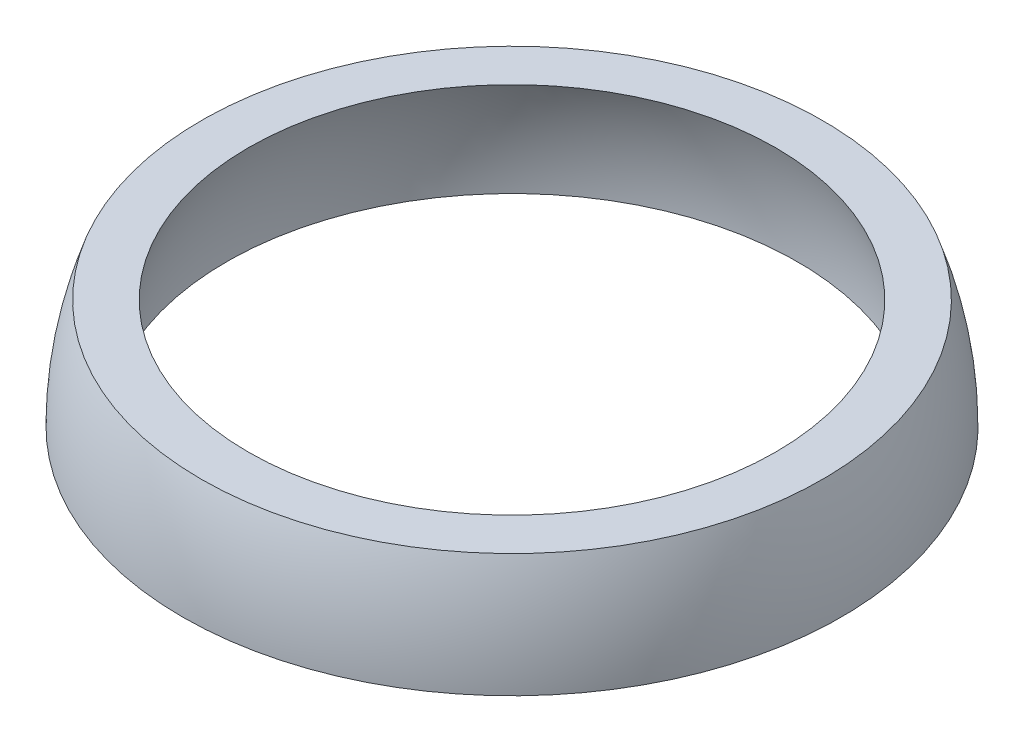
ISO-10303-21;
HEADER;
FILE_DESCRIPTION(('STEP AP214'),'2;1');
FILE_NAME('part.step','',(''),(''),'','','');
FILE_SCHEMA(('AUTOMOTIVE_DESIGN { 1 0 10303 214 1 1 1 1 }'));
ENDSEC;
DATA;
#1=APPLICATION_CONTEXT('core data for automotive mechanical design processes');
#2=APPLICATION_PROTOCOL_DEFINITION('international standard','automotive_design',2000,#1);
#3=PRODUCT_CONTEXT('',#1,'mechanical');
#4=PRODUCT('Part','Part','',(#3));
#5=PRODUCT_RELATED_PRODUCT_CATEGORY('part','',(#4));
#6=PRODUCT_DEFINITION_FORMATION('','',#4);
#7=PRODUCT_DEFINITION_CONTEXT('part definition',#1,'design');
#8=PRODUCT_DEFINITION('design','',#6,#7);
#9=PRODUCT_DEFINITION_SHAPE('','',#8);
#10=(LENGTH_UNIT() NAMED_UNIT(*) SI_UNIT(.MILLI.,.METRE.));
#11=(NAMED_UNIT(*) PLANE_ANGLE_UNIT() SI_UNIT($,.RADIAN.));
#12=(NAMED_UNIT(*) SI_UNIT($,.STERADIAN.) SOLID_ANGLE_UNIT());
#13=UNCERTAINTY_MEASURE_WITH_UNIT(LENGTH_MEASURE(1.E-05),#10,'distance_accuracy_value','');
#14=(GEOMETRIC_REPRESENTATION_CONTEXT(3) GLOBAL_UNCERTAINTY_ASSIGNED_CONTEXT((#13)) GLOBAL_UNIT_ASSIGNED_CONTEXT((#10,
#11,#12)) REPRESENTATION_CONTEXT('',''));
#15=CARTESIAN_POINT('',(0.,0.,0.));
#16=DIRECTION('',(0.,0.,1.));
#17=DIRECTION('',(1.,0.,0.));
#18=AXIS2_PLACEMENT_3D('',#15,#16,#17);
#19=CARTESIAN_POINT('',(0.,0.,0.));
#20=DIRECTION('',(0.,1.,0.));
#21=DIRECTION('',(1.,0.,0.));
#22=AXIS2_PLACEMENT_3D('',#19,#20,#21);
#23=SPHERICAL_SURFACE('',#22,19.05);
#24=CARTESIAN_POINT('',(0.,6.35,0.));
#25=DIRECTION('',(0.,1.,0.));
#26=DIRECTION('',(0.,0.,1.));
#27=AXIS2_PLACEMENT_3D('',#24,#25,#26);
#28=CIRCLE('',#27,17.9605122421383);
#29=CARTESIAN_POINT('',(0.,6.35,17.9605122421383));
#30=VERTEX_POINT('',#29);
#31=EDGE_CURVE('E10',#30,#30,#28,.T.);
#32=ORIENTED_EDGE('',*,*,#31,.F.);
#33=EDGE_LOOP('',(#32));
#34=FACE_BOUND('',#33,.T.);
#35=CARTESIAN_POINT('',(0.,0.,0.));
#36=DIRECTION('',(0.,1.,0.));
#37=DIRECTION('',(0.,0.,1.));
#38=AXIS2_PLACEMENT_3D('',#35,#36,#37);
#39=CIRCLE('',#38,19.05);
#40=CARTESIAN_POINT('',(0.,0.,19.05));
#41=VERTEX_POINT('',#40);
#42=EDGE_CURVE('E45',#41,#41,#39,.T.);
#43=ORIENTED_EDGE('',*,*,#42,.T.);
#44=EDGE_LOOP('',(#43));
#45=FACE_BOUND('',#44,.T.);
#46=ADVANCED_FACE('F31',(#34,#45),#23,.T.);
#47=CARTESIAN_POINT('',(15.24,6.35,0.));
#48=DIRECTION('',(0.,-1.,0.));
#49=DIRECTION('',(0.,0.,-1.));
#50=AXIS2_PLACEMENT_3D('',#47,#48,#49);
#51=PLANE('',#50);
#52=CARTESIAN_POINT('',(0.,6.35,0.));
#53=DIRECTION('',(0.,1.,0.));
#54=DIRECTION('',(0.,0.,1.));
#55=AXIS2_PLACEMENT_3D('',#52,#53,#54);
#56=CIRCLE('',#55,15.24);
#57=CARTESIAN_POINT('',(0.,6.35,15.24));
#58=VERTEX_POINT('',#57);
#59=EDGE_CURVE('E37',#58,#58,#56,.T.);
#60=ORIENTED_EDGE('',*,*,#59,.F.);
#61=EDGE_LOOP('',(#60));
#62=FACE_BOUND('',#61,.T.);
#63=ORIENTED_EDGE('',*,*,#31,.T.);
#64=EDGE_LOOP('',(#63));
#65=FACE_BOUND('',#64,.T.);
#66=ADVANCED_FACE('F60',(#62,#65),#51,.F.);
#67=CARTESIAN_POINT('',(0.,0.,0.));
#68=DIRECTION('',(0.,1.,0.));
#69=DIRECTION('',(1.,0.,0.));
#70=AXIS2_PLACEMENT_3D('',#67,#68,#69);
#71=SPHERICAL_SURFACE('',#70,16.51);
#72=CARTESIAN_POINT('',(0.,0.,0.));
#73=DIRECTION('',(0.,1.,0.));
#74=DIRECTION('',(0.,0.,1.));
#75=AXIS2_PLACEMENT_3D('',#72,#73,#74);
#76=CIRCLE('',#75,16.51);
#77=CARTESIAN_POINT('',(0.,0.,16.51));
#78=VERTEX_POINT('',#77);
#79=EDGE_CURVE('E41',#78,#78,#76,.T.);
#80=ORIENTED_EDGE('',*,*,#79,.F.);
#81=EDGE_LOOP('',(#80));
#82=FACE_BOUND('',#81,.T.);
#83=ORIENTED_EDGE('',*,*,#59,.T.);
#84=EDGE_LOOP('',(#83));
#85=FACE_BOUND('',#84,.T.);
#86=ADVANCED_FACE('F55',(#82,#85),#71,.F.);
#87=CARTESIAN_POINT('',(16.51,0.,0.));
#88=DIRECTION('',(0.,1.,0.));
#89=DIRECTION('',(0.,0.,1.));
#90=AXIS2_PLACEMENT_3D('',#87,#88,#89);
#91=PLANE('',#90);
#92=ORIENTED_EDGE('',*,*,#42,.F.);
#93=EDGE_LOOP('',(#92));
#94=FACE_BOUND('',#93,.T.);
#95=ORIENTED_EDGE('',*,*,#79,.T.);
#96=EDGE_LOOP('',(#95));
#97=FACE_BOUND('',#96,.T.);
#98=ADVANCED_FACE('F52',(#94,#97),#91,.F.);
#99=CLOSED_SHELL('',(#46,#66,#86,#98));
#100=MANIFOLD_SOLID_BREP('B2',#99);
#101=ADVANCED_BREP_SHAPE_REPRESENTATION('',(#18,#100),#14);
#102=SHAPE_DEFINITION_REPRESENTATION(#9,#101);
ENDSEC;
END-ISO-10303-21;
